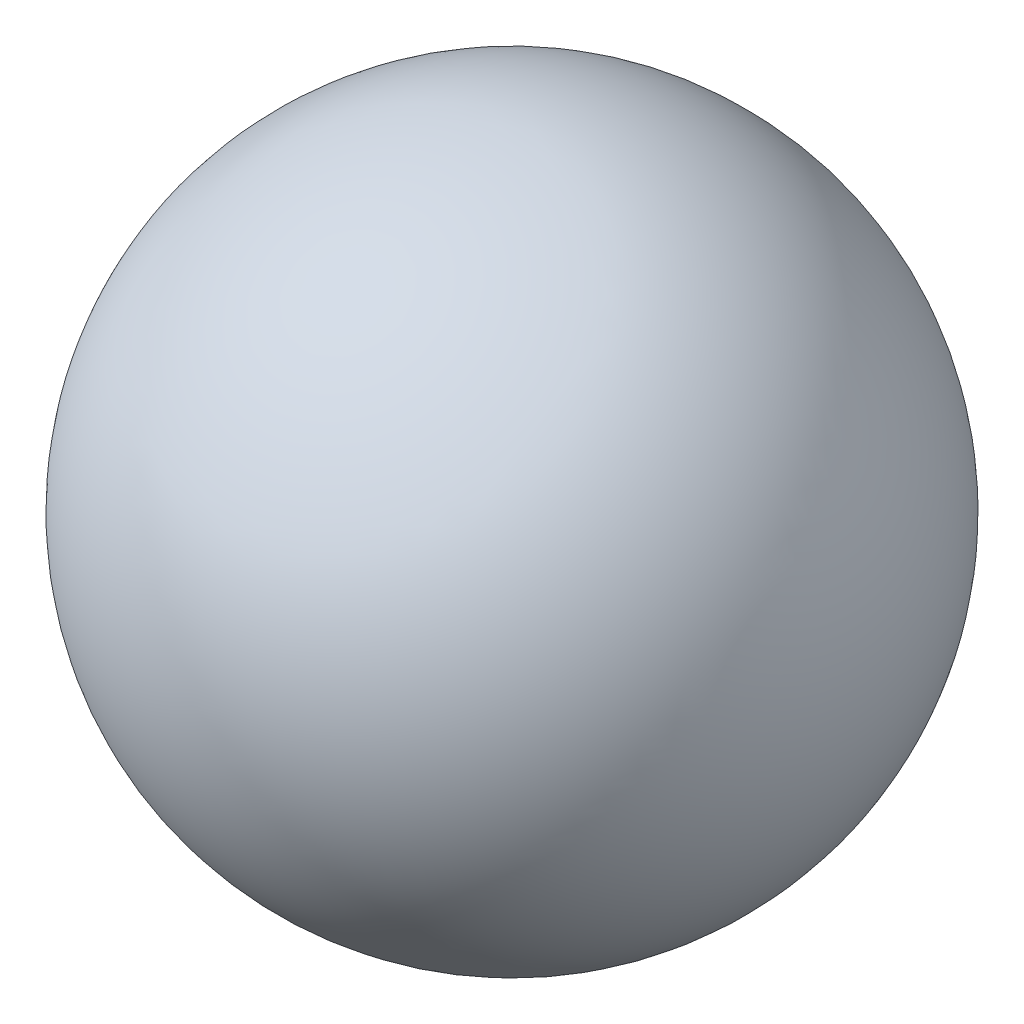
ISO-10303-21;
HEADER;
FILE_DESCRIPTION(('STEP AP214'),'2;1');
FILE_NAME('part.step','',(''),(''),'','','');
FILE_SCHEMA(('AUTOMOTIVE_DESIGN { 1 0 10303 214 1 1 1 1 }'));
ENDSEC;
DATA;
#1=APPLICATION_CONTEXT('core data for automotive mechanical design processes');
#2=APPLICATION_PROTOCOL_DEFINITION('international standard','automotive_design',2000,#1);
#3=PRODUCT_CONTEXT('',#1,'mechanical');
#4=PRODUCT('Part','Part','',(#3));
#5=PRODUCT_RELATED_PRODUCT_CATEGORY('part','',(#4));
#6=PRODUCT_DEFINITION_FORMATION('','',#4);
#7=PRODUCT_DEFINITION_CONTEXT('part definition',#1,'design');
#8=PRODUCT_DEFINITION('design','',#6,#7);
#9=PRODUCT_DEFINITION_SHAPE('','',#8);
#10=(LENGTH_UNIT() NAMED_UNIT(*) SI_UNIT(.MILLI.,.METRE.));
#11=(NAMED_UNIT(*) PLANE_ANGLE_UNIT() SI_UNIT($,.RADIAN.));
#12=(NAMED_UNIT(*) SI_UNIT($,.STERADIAN.) SOLID_ANGLE_UNIT());
#13=UNCERTAINTY_MEASURE_WITH_UNIT(LENGTH_MEASURE(1.E-05),#10,'distance_accuracy_value','');
#14=(GEOMETRIC_REPRESENTATION_CONTEXT(3) GLOBAL_UNCERTAINTY_ASSIGNED_CONTEXT((#13)) GLOBAL_UNIT_ASSIGNED_CONTEXT((#10,
#11,#12)) REPRESENTATION_CONTEXT('',''));
#15=CARTESIAN_POINT('',(0.,0.,0.));
#16=DIRECTION('',(0.,0.,1.));
#17=DIRECTION('',(1.,0.,0.));
#18=AXIS2_PLACEMENT_3D('',#15,#16,#17);
#19=CARTESIAN_POINT('',(9.18044413219367,-2.47385187686479,21.8339124873236));
#20=DIRECTION('',(1.,0.,0.));
#21=DIRECTION('',(0.,0.,1.));
#22=AXIS2_PLACEMENT_3D('',#19,#20,#21);
#23=SPHERICAL_SURFACE('',#22,19.);
#24=CARTESIAN_POINT('',(28.1804441321937,-2.47385187686479,21.8339124873236));
#25=VERTEX_POINT('',#24);
#26=VERTEX_LOOP('',#25);
#27=FACE_BOUND('',#26,.T.);
#28=ADVANCED_FACE('F29',(#27),#23,.T.);
#29=CLOSED_SHELL('',(#28));
#30=MANIFOLD_SOLID_BREP('B2',#29);
#31=ADVANCED_BREP_SHAPE_REPRESENTATION('',(#18,#30),#14);
#32=SHAPE_DEFINITION_REPRESENTATION(#9,#31);
ENDSEC;
END-ISO-10303-21;
